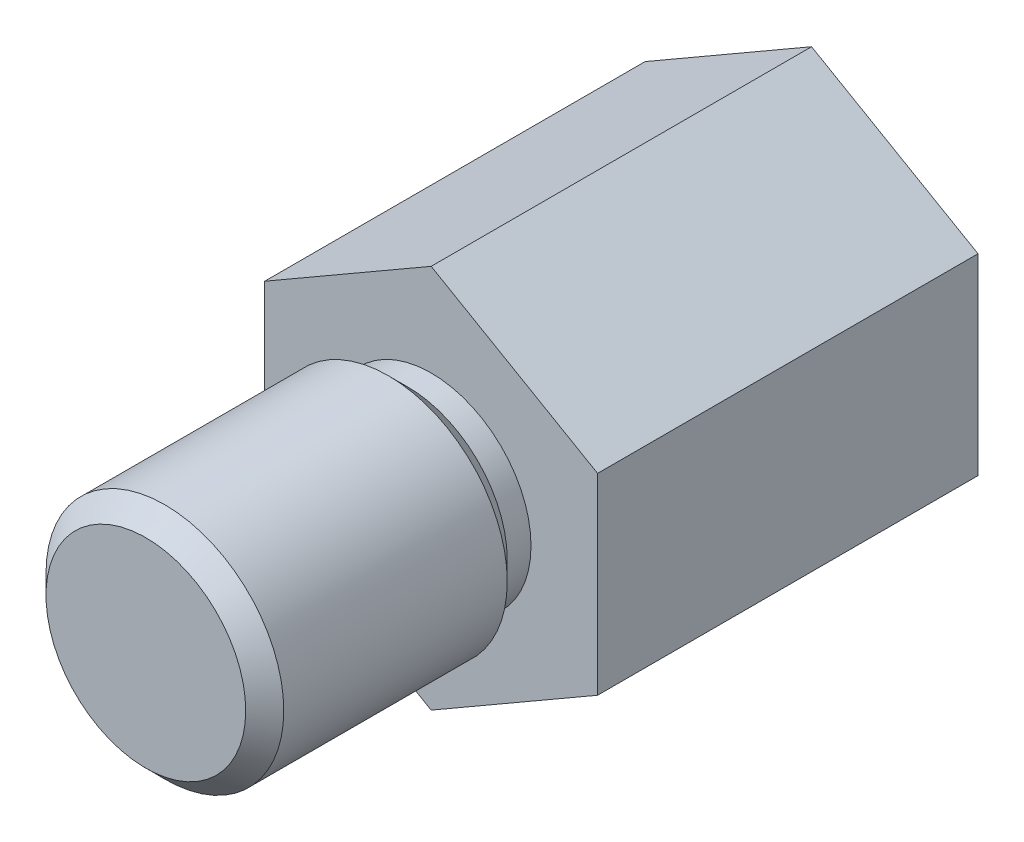
ISO-10303-21;
HEADER;
FILE_DESCRIPTION(('STEP AP214'),'2;1');
FILE_NAME('part.step','',(''),(''),'','','');
FILE_SCHEMA(('AUTOMOTIVE_DESIGN { 1 0 10303 214 1 1 1 1 }'));
ENDSEC;
DATA;
#1=APPLICATION_CONTEXT('core data for automotive mechanical design processes');
#2=APPLICATION_PROTOCOL_DEFINITION('international standard','automotive_design',2000,#1);
#3=PRODUCT_CONTEXT('',#1,'mechanical');
#4=PRODUCT('Part','Part','',(#3));
#5=PRODUCT_RELATED_PRODUCT_CATEGORY('part','',(#4));
#6=PRODUCT_DEFINITION_FORMATION('','',#4);
#7=PRODUCT_DEFINITION_CONTEXT('part definition',#1,'design');
#8=PRODUCT_DEFINITION('design','',#6,#7);
#9=PRODUCT_DEFINITION_SHAPE('','',#8);
#10=(LENGTH_UNIT() NAMED_UNIT(*) SI_UNIT(.MILLI.,.METRE.));
#11=(NAMED_UNIT(*) PLANE_ANGLE_UNIT() SI_UNIT($,.RADIAN.));
#12=(NAMED_UNIT(*) SI_UNIT($,.STERADIAN.) SOLID_ANGLE_UNIT());
#13=UNCERTAINTY_MEASURE_WITH_UNIT(LENGTH_MEASURE(1.E-05),#10,'distance_accuracy_value','');
#14=(GEOMETRIC_REPRESENTATION_CONTEXT(3) GLOBAL_UNCERTAINTY_ASSIGNED_CONTEXT((#13)) GLOBAL_UNIT_ASSIGNED_CONTEXT((#10,
#11,#12)) REPRESENTATION_CONTEXT('',''));
#15=CARTESIAN_POINT('',(0.,0.,0.));
#16=DIRECTION('',(0.,0.,1.));
#17=DIRECTION('',(1.,0.,0.));
#18=AXIS2_PLACEMENT_3D('',#15,#16,#17);
#19=CARTESIAN_POINT('',(0.,4.04145188432737,8.));
#20=DIRECTION('',(0.,0.,1.));
#21=DIRECTION('',(1.,0.,0.));
#22=AXIS2_PLACEMENT_3D('',#19,#20,#21);
#23=PLANE('',#22);
#24=DIRECTION('',(-0.866025403784438,0.5,0.));
#25=VECTOR('',#24,1.);
#26=CARTESIAN_POINT('',(3.49999999999999,2.02072594216368,8.));
#27=LINE('',#26,#25);
#28=CARTESIAN_POINT('',(3.49999999999999,2.02072594216368,8.));
#29=VERTEX_POINT('',#28);
#30=CARTESIAN_POINT('',(0.,4.04145188432737,8.));
#31=VERTEX_POINT('',#30);
#32=EDGE_CURVE('E119',#29,#31,#27,.T.);
#33=ORIENTED_EDGE('',*,*,#32,.T.);
#34=DIRECTION('',(-0.866025403784438,-0.5,0.));
#35=VECTOR('',#34,1.);
#36=CARTESIAN_POINT('',(0.,4.04145188432737,8.));
#37=LINE('',#36,#35);
#38=CARTESIAN_POINT('',(-3.5,2.02072594216368,8.));
#39=VERTEX_POINT('',#38);
#40=EDGE_CURVE('E121',#31,#39,#37,.T.);
#41=ORIENTED_EDGE('',*,*,#40,.T.);
#42=DIRECTION('',(0.,-1.,0.));
#43=VECTOR('',#42,1.);
#44=CARTESIAN_POINT('',(-3.5,2.02072594216368,8.));
#45=LINE('',#44,#43);
#46=CARTESIAN_POINT('',(-3.5,-2.0207259421637,8.));
#47=VERTEX_POINT('',#46);
#48=EDGE_CURVE('E123',#39,#47,#45,.T.);
#49=ORIENTED_EDGE('',*,*,#48,.T.);
#50=DIRECTION('',(0.866025403784438,-0.5,0.));
#51=VECTOR('',#50,1.);
#52=CARTESIAN_POINT('',(-3.5,-2.0207259421637,8.));
#53=LINE('',#52,#51);
#54=CARTESIAN_POINT('',(0.,-4.04145188432739,8.));
#55=VERTEX_POINT('',#54);
#56=EDGE_CURVE('E125',#47,#55,#53,.T.);
#57=ORIENTED_EDGE('',*,*,#56,.T.);
#58=DIRECTION('',(0.866025403784439,0.5,0.));
#59=VECTOR('',#58,1.);
#60=CARTESIAN_POINT('',(0.,-4.04145188432739,8.));
#61=LINE('',#60,#59);
#62=CARTESIAN_POINT('',(3.49999999999999,-2.0207259421637,8.));
#63=VERTEX_POINT('',#62);
#64=EDGE_CURVE('E49',#55,#63,#61,.T.);
#65=ORIENTED_EDGE('',*,*,#64,.T.);
#66=DIRECTION('',(0.,1.,0.));
#67=VECTOR('',#66,1.);
#68=CARTESIAN_POINT('',(3.49999999999999,-2.0207259421637,8.));
#69=LINE('',#68,#67);
#70=EDGE_CURVE('E44',#63,#29,#69,.T.);
#71=ORIENTED_EDGE('',*,*,#70,.T.);
#72=EDGE_LOOP('',(#33,#41,#49,#57,#65,#71));
#73=FACE_BOUND('',#72,.T.);
#74=CARTESIAN_POINT('',(0.,0.,8.));
#75=DIRECTION('',(0.,0.,1.));
#76=DIRECTION('',(1.,0.,0.));
#77=AXIS2_PLACEMENT_3D('',#74,#75,#76);
#78=CIRCLE('',#77,2.1);
#79=CARTESIAN_POINT('',(2.1,0.,8.));
#80=VERTEX_POINT('',#79);
#81=EDGE_CURVE('E100',#80,#80,#78,.T.);
#82=ORIENTED_EDGE('',*,*,#81,.F.);
#83=EDGE_LOOP('',(#82));
#84=FACE_BOUND('',#83,.T.);
#85=ADVANCED_FACE('F29',(#73,#84),#23,.T.);
#86=CARTESIAN_POINT('',(3.49999999999999,2.02072594216368,8.));
#87=DIRECTION('',(-0.5,-0.866025403784438,0.));
#88=DIRECTION('',(0.866025403784438,-0.5,0.));
#89=AXIS2_PLACEMENT_3D('',#86,#87,#88);
#90=PLANE('',#89);
#91=DIRECTION('',(-0.866025403784438,0.5,0.));
#92=VECTOR('',#91,1.);
#93=CARTESIAN_POINT('',(3.49999999999999,2.02072594216368,0.));
#94=LINE('',#93,#92);
#95=CARTESIAN_POINT('',(3.49999999999999,2.02072594216368,0.));
#96=VERTEX_POINT('',#95);
#97=CARTESIAN_POINT('',(0.,4.04145188432737,0.));
#98=VERTEX_POINT('',#97);
#99=EDGE_CURVE('E106',#96,#98,#94,.T.);
#100=ORIENTED_EDGE('',*,*,#99,.T.);
#101=DIRECTION('',(0.,0.,-1.));
#102=VECTOR('',#101,1.);
#103=CARTESIAN_POINT('',(0.,4.04145188432737,8.));
#104=LINE('',#103,#102);
#105=EDGE_CURVE('E144',#31,#98,#104,.T.);
#106=ORIENTED_EDGE('',*,*,#105,.F.);
#107=ORIENTED_EDGE('',*,*,#32,.F.);
#108=DIRECTION('',(0.,0.,-1.));
#109=VECTOR('',#108,1.);
#110=CARTESIAN_POINT('',(3.49999999999999,2.02072594216368,8.));
#111=LINE('',#110,#109);
#112=EDGE_CURVE('E129',#29,#96,#111,.T.);
#113=ORIENTED_EDGE('',*,*,#112,.T.);
#114=EDGE_LOOP('',(#100,#106,#107,#113));
#115=FACE_BOUND('',#114,.T.);
#116=ADVANCED_FACE('F31',(#115),#90,.F.);
#117=CARTESIAN_POINT('',(0.,4.04145188432737,8.));
#118=DIRECTION('',(0.5,-0.866025403784438,0.));
#119=DIRECTION('',(0.866025403784438,0.5,0.));
#120=AXIS2_PLACEMENT_3D('',#117,#118,#119);
#121=PLANE('',#120);
#122=DIRECTION('',(-0.866025403784438,-0.5,0.));
#123=VECTOR('',#122,1.);
#124=CARTESIAN_POINT('',(0.,4.04145188432737,0.));
#125=LINE('',#124,#123);
#126=CARTESIAN_POINT('',(-3.5,2.02072594216368,0.));
#127=VERTEX_POINT('',#126);
#128=EDGE_CURVE('E109',#98,#127,#125,.T.);
#129=ORIENTED_EDGE('',*,*,#128,.T.);
#130=DIRECTION('',(0.,0.,-1.));
#131=VECTOR('',#130,1.);
#132=CARTESIAN_POINT('',(-3.5,2.02072594216368,8.));
#133=LINE('',#132,#131);
#134=EDGE_CURVE('E141',#39,#127,#133,.T.);
#135=ORIENTED_EDGE('',*,*,#134,.F.);
#136=ORIENTED_EDGE('',*,*,#40,.F.);
#137=ORIENTED_EDGE('',*,*,#105,.T.);
#138=EDGE_LOOP('',(#129,#135,#136,#137));
#139=FACE_BOUND('',#138,.T.);
#140=ADVANCED_FACE('F175',(#139),#121,.F.);
#141=CARTESIAN_POINT('',(-3.5,2.02072594216368,8.));
#142=DIRECTION('',(1.,0.,0.));
#143=DIRECTION('',(0.,0.,-1.));
#144=AXIS2_PLACEMENT_3D('',#141,#142,#143);
#145=PLANE('',#144);
#146=DIRECTION('',(0.,-1.,0.));
#147=VECTOR('',#146,1.);
#148=CARTESIAN_POINT('',(-3.5,2.02072594216368,0.));
#149=LINE('',#148,#147);
#150=CARTESIAN_POINT('',(-3.5,-2.0207259421637,0.));
#151=VERTEX_POINT('',#150);
#152=EDGE_CURVE('E111',#127,#151,#149,.T.);
#153=ORIENTED_EDGE('',*,*,#152,.T.);
#154=DIRECTION('',(0.,0.,-1.));
#155=VECTOR('',#154,1.);
#156=CARTESIAN_POINT('',(-3.5,-2.0207259421637,8.));
#157=LINE('',#156,#155);
#158=EDGE_CURVE('E138',#47,#151,#157,.T.);
#159=ORIENTED_EDGE('',*,*,#158,.F.);
#160=ORIENTED_EDGE('',*,*,#48,.F.);
#161=ORIENTED_EDGE('',*,*,#134,.T.);
#162=EDGE_LOOP('',(#153,#159,#160,#161));
#163=FACE_BOUND('',#162,.T.);
#164=ADVANCED_FACE('F192',(#163),#145,.F.);
#165=CARTESIAN_POINT('',(-3.5,-2.0207259421637,8.));
#166=DIRECTION('',(0.5,0.866025403784439,0.));
#167=DIRECTION('',(-0.866025403784439,0.5,0.));
#168=AXIS2_PLACEMENT_3D('',#165,#166,#167);
#169=PLANE('',#168);
#170=DIRECTION('',(0.866025403784438,-0.5,0.));
#171=VECTOR('',#170,1.);
#172=CARTESIAN_POINT('',(-3.5,-2.0207259421637,0.));
#173=LINE('',#172,#171);
#174=CARTESIAN_POINT('',(0.,-4.04145188432739,0.));
#175=VERTEX_POINT('',#174);
#176=EDGE_CURVE('E113',#151,#175,#173,.T.);
#177=ORIENTED_EDGE('',*,*,#176,.T.);
#178=DIRECTION('',(0.,0.,-1.));
#179=VECTOR('',#178,1.);
#180=CARTESIAN_POINT('',(0.,-4.04145188432739,8.));
#181=LINE('',#180,#179);
#182=EDGE_CURVE('E135',#55,#175,#181,.T.);
#183=ORIENTED_EDGE('',*,*,#182,.F.);
#184=ORIENTED_EDGE('',*,*,#56,.F.);
#185=ORIENTED_EDGE('',*,*,#158,.T.);
#186=EDGE_LOOP('',(#177,#183,#184,#185));
#187=FACE_BOUND('',#186,.T.);
#188=ADVANCED_FACE('F188',(#187),#169,.F.);
#189=CARTESIAN_POINT('',(0.,-4.04145188432739,8.));
#190=DIRECTION('',(-0.5,0.866025403784439,0.));
#191=DIRECTION('',(-0.866025403784439,-0.5,0.));
#192=AXIS2_PLACEMENT_3D('',#189,#190,#191);
#193=PLANE('',#192);
#194=DIRECTION('',(0.866025403784439,0.5,0.));
#195=VECTOR('',#194,1.);
#196=CARTESIAN_POINT('',(0.,-4.04145188432739,0.));
#197=LINE('',#196,#195);
#198=CARTESIAN_POINT('',(3.49999999999999,-2.0207259421637,0.));
#199=VERTEX_POINT('',#198);
#200=EDGE_CURVE('E115',#175,#199,#197,.T.);
#201=ORIENTED_EDGE('',*,*,#200,.T.);
#202=DIRECTION('',(0.,0.,-1.));
#203=VECTOR('',#202,1.);
#204=CARTESIAN_POINT('',(3.49999999999999,-2.0207259421637,8.));
#205=LINE('',#204,#203);
#206=EDGE_CURVE('E132',#63,#199,#205,.T.);
#207=ORIENTED_EDGE('',*,*,#206,.F.);
#208=ORIENTED_EDGE('',*,*,#64,.F.);
#209=ORIENTED_EDGE('',*,*,#182,.T.);
#210=EDGE_LOOP('',(#201,#207,#208,#209));
#211=FACE_BOUND('',#210,.T.);
#212=ADVANCED_FACE('F184',(#211),#193,.F.);
#213=CARTESIAN_POINT('',(3.49999999999999,-2.0207259421637,8.));
#214=DIRECTION('',(-1.,0.,0.));
#215=DIRECTION('',(0.,-1.,0.));
#216=AXIS2_PLACEMENT_3D('',#213,#214,#215);
#217=PLANE('',#216);
#218=DIRECTION('',(0.,1.,0.));
#219=VECTOR('',#218,1.);
#220=CARTESIAN_POINT('',(3.49999999999999,-2.0207259421637,0.));
#221=LINE('',#220,#219);
#222=EDGE_CURVE('E117',#199,#96,#221,.T.);
#223=ORIENTED_EDGE('',*,*,#222,.T.);
#224=ORIENTED_EDGE('',*,*,#112,.F.);
#225=ORIENTED_EDGE('',*,*,#70,.F.);
#226=ORIENTED_EDGE('',*,*,#206,.T.);
#227=EDGE_LOOP('',(#223,#224,#225,#226));
#228=FACE_BOUND('',#227,.T.);
#229=ADVANCED_FACE('F181',(#228),#217,.F.);
#230=CARTESIAN_POINT('',(0.,4.04145188432737,0.));
#231=DIRECTION('',(0.,0.,1.));
#232=DIRECTION('',(1.,0.,0.));
#233=AXIS2_PLACEMENT_3D('',#230,#231,#232);
#234=PLANE('',#233);
#235=CARTESIAN_POINT('',(0.,0.,0.));
#236=DIRECTION('',(0.,0.,-1.));
#237=DIRECTION('',(-1.,0.,0.));
#238=AXIS2_PLACEMENT_3D('',#235,#236,#237);
#239=CIRCLE('',#238,2.);
#240=CARTESIAN_POINT('',(-2.,0.,0.));
#241=VERTEX_POINT('',#240);
#242=EDGE_CURVE('E95',#241,#241,#239,.T.);
#243=ORIENTED_EDGE('',*,*,#242,.F.);
#244=EDGE_LOOP('',(#243));
#245=FACE_BOUND('',#244,.T.);
#246=ORIENTED_EDGE('',*,*,#99,.F.);
#247=ORIENTED_EDGE('',*,*,#222,.F.);
#248=ORIENTED_EDGE('',*,*,#200,.F.);
#249=ORIENTED_EDGE('',*,*,#176,.F.);
#250=ORIENTED_EDGE('',*,*,#152,.F.);
#251=ORIENTED_EDGE('',*,*,#128,.F.);
#252=EDGE_LOOP('',(#246,#247,#248,#249,#250,#251));
#253=FACE_BOUND('',#252,.T.);
#254=ADVANCED_FACE('F180',(#245,#253),#234,.F.);
#255=CARTESIAN_POINT('',(0.,0.,8.5));
#256=DIRECTION('',(0.,0.,-1.));
#257=DIRECTION('',(-1.,0.,0.));
#258=AXIS2_PLACEMENT_3D('',#255,#256,#257);
#259=CYLINDRICAL_SURFACE('',#258,2.1);
#260=CARTESIAN_POINT('',(0.,0.,8.5));
#261=DIRECTION('',(0.,0.,1.));
#262=DIRECTION('',(1.,0.,0.));
#263=AXIS2_PLACEMENT_3D('',#260,#261,#262);
#264=CIRCLE('',#263,2.1);
#265=CARTESIAN_POINT('',(2.1,0.,8.5));
#266=VERTEX_POINT('',#265);
#267=EDGE_CURVE('E103',#266,#266,#264,.T.);
#268=ORIENTED_EDGE('',*,*,#267,.F.);
#269=EDGE_LOOP('',(#268));
#270=FACE_BOUND('',#269,.T.);
#271=ORIENTED_EDGE('',*,*,#81,.T.);
#272=EDGE_LOOP('',(#271));
#273=FACE_BOUND('',#272,.T.);
#274=ADVANCED_FACE('F214',(#270,#273),#259,.T.);
#275=CARTESIAN_POINT('',(0.,0.,14.));
#276=DIRECTION('',(0.,0.,1.));
#277=DIRECTION('',(1.,0.,0.));
#278=AXIS2_PLACEMENT_3D('',#275,#276,#277);
#279=PLANE('',#278);
#280=CARTESIAN_POINT('',(0.,0.,14.));
#281=DIRECTION('',(0.,0.,1.));
#282=DIRECTION('',(1.,0.,0.));
#283=AXIS2_PLACEMENT_3D('',#280,#281,#282);
#284=CIRCLE('',#283,2.1);
#285=CARTESIAN_POINT('',(2.1,0.,14.));
#286=VERTEX_POINT('',#285);
#287=EDGE_CURVE('E11',#286,#286,#284,.T.);
#288=ORIENTED_EDGE('',*,*,#287,.T.);
#289=EDGE_LOOP('',(#288));
#290=FACE_BOUND('',#289,.T.);
#291=ADVANCED_FACE('F167',(#290),#279,.T.);
#292=CARTESIAN_POINT('',(0.,0.,14.));
#293=DIRECTION('',(0.,0.,-1.));
#294=DIRECTION('',(-1.,0.,0.));
#295=AXIS2_PLACEMENT_3D('',#292,#293,#294);
#296=CYLINDRICAL_SURFACE('',#295,2.5);
#297=CARTESIAN_POINT('',(0.,0.,8.9));
#298=DIRECTION('',(0.,0.,1.));
#299=DIRECTION('',(1.,0.,0.));
#300=AXIS2_PLACEMENT_3D('',#297,#298,#299);
#301=CIRCLE('',#300,2.5);
#302=CARTESIAN_POINT('',(2.5,0.,8.9));
#303=VERTEX_POINT('',#302);
#304=EDGE_CURVE('E37',#303,#303,#301,.T.);
#305=ORIENTED_EDGE('',*,*,#304,.T.);
#306=EDGE_LOOP('',(#305));
#307=FACE_BOUND('',#306,.T.);
#308=CARTESIAN_POINT('',(0.,0.,13.6));
#309=DIRECTION('',(0.,0.,1.));
#310=DIRECTION('',(1.,0.,0.));
#311=AXIS2_PLACEMENT_3D('',#308,#309,#310);
#312=CIRCLE('',#311,2.5);
#313=CARTESIAN_POINT('',(2.5,0.,13.6));
#314=VERTEX_POINT('',#313);
#315=EDGE_CURVE('E147',#314,#314,#312,.F.);
#316=ORIENTED_EDGE('',*,*,#315,.T.);
#317=EDGE_LOOP('',(#316));
#318=FACE_BOUND('',#317,.T.);
#319=ADVANCED_FACE('F152',(#307,#318),#296,.T.);
#320=CARTESIAN_POINT('',(0.,0.,8.9));
#321=DIRECTION('',(0.,0.,1.));
#322=DIRECTION('',(1.,0.,0.));
#323=AXIS2_PLACEMENT_3D('',#320,#321,#322);
#324=CONICAL_SURFACE('',#323,2.5,0.785398163397451);
#325=CARTESIAN_POINT('',(2.1,0.,8.5));
#326=CARTESIAN_POINT('',(2.10416666666666,0.,8.50416666666666));
#327=CARTESIAN_POINT('',(2.10833333333333,0.,8.50833333333333));
#328=CARTESIAN_POINT('',(2.11666666666666,0.,8.51666666666667));
#329=CARTESIAN_POINT('',(2.12083333333333,0.,8.52083333333333));
#330=CARTESIAN_POINT('',(2.12916666666666,0.,8.52916666666667));
#331=CARTESIAN_POINT('',(2.13333333333333,0.,8.53333333333333));
#332=CARTESIAN_POINT('',(2.14166666666666,0.,8.54166666666667));
#333=CARTESIAN_POINT('',(2.14583333333333,0.,8.54583333333333));
#334=CARTESIAN_POINT('',(2.15416666666666,0.,8.55416666666667));
#335=CARTESIAN_POINT('',(2.15833333333333,0.,8.55833333333333));
#336=CARTESIAN_POINT('',(2.16666666666666,0.,8.56666666666666));
#337=CARTESIAN_POINT('',(2.17083333333333,0.,8.57083333333333));
#338=CARTESIAN_POINT('',(2.17916666666666,0.,8.57916666666667));
#339=CARTESIAN_POINT('',(2.18333333333333,0.,8.58333333333333));
#340=CARTESIAN_POINT('',(2.19166666666666,0.,8.59166666666667));
#341=CARTESIAN_POINT('',(2.19583333333333,0.,8.59583333333333));
#342=CARTESIAN_POINT('',(2.20416666666666,0.,8.60416666666667));
#343=CARTESIAN_POINT('',(2.20833333333333,0.,8.60833333333333));
#344=CARTESIAN_POINT('',(2.21666666666666,0.,8.61666666666667));
#345=CARTESIAN_POINT('',(2.22083333333333,0.,8.62083333333333));
#346=CARTESIAN_POINT('',(2.22916666666666,0.,8.62916666666666));
#347=CARTESIAN_POINT('',(2.23333333333333,0.,8.63333333333333));
#348=CARTESIAN_POINT('',(2.24166666666666,0.,8.64166666666667));
#349=CARTESIAN_POINT('',(2.24583333333333,0.,8.64583333333333));
#350=CARTESIAN_POINT('',(2.25416666666666,0.,8.65416666666667));
#351=CARTESIAN_POINT('',(2.25833333333333,0.,8.65833333333333));
#352=CARTESIAN_POINT('',(2.26666666666666,0.,8.66666666666667));
#353=CARTESIAN_POINT('',(2.27083333333333,0.,8.67083333333333));
#354=CARTESIAN_POINT('',(2.27916666666667,0.,8.67916666666667));
#355=CARTESIAN_POINT('',(2.28333333333333,0.,8.68333333333333));
#356=CARTESIAN_POINT('',(2.29166666666666,0.,8.69166666666666));
#357=CARTESIAN_POINT('',(2.29583333333333,0.,8.69583333333333));
#358=CARTESIAN_POINT('',(2.30416666666666,0.,8.70416666666667));
#359=CARTESIAN_POINT('',(2.30833333333333,0.,8.70833333333333));
#360=CARTESIAN_POINT('',(2.31666666666666,0.,8.71666666666667));
#361=CARTESIAN_POINT('',(2.32083333333333,0.,8.72083333333333));
#362=CARTESIAN_POINT('',(2.32916666666666,0.,8.72916666666667));
#363=CARTESIAN_POINT('',(2.33333333333333,0.,8.73333333333333));
#364=CARTESIAN_POINT('',(2.34166666666667,0.,8.74166666666667));
#365=CARTESIAN_POINT('',(2.34583333333333,0.,8.74583333333333));
#366=CARTESIAN_POINT('',(2.35416666666667,0.,8.75416666666666));
#367=CARTESIAN_POINT('',(2.35833333333333,0.,8.75833333333333));
#368=CARTESIAN_POINT('',(2.36666666666666,0.,8.76666666666667));
#369=CARTESIAN_POINT('',(2.37083333333333,0.,8.77083333333333));
#370=CARTESIAN_POINT('',(2.37916666666667,0.,8.77916666666667));
#371=CARTESIAN_POINT('',(2.38333333333333,0.,8.78333333333333));
#372=CARTESIAN_POINT('',(2.39166666666667,0.,8.79166666666666));
#373=CARTESIAN_POINT('',(2.39583333333333,0.,8.79583333333333));
#374=CARTESIAN_POINT('',(2.40416666666667,0.,8.80416666666667));
#375=CARTESIAN_POINT('',(2.40833333333333,0.,8.80833333333333));
#376=CARTESIAN_POINT('',(2.41666666666667,0.,8.81666666666666));
#377=CARTESIAN_POINT('',(2.42083333333333,0.,8.82083333333333));
#378=CARTESIAN_POINT('',(2.42916666666667,0.,8.82916666666667));
#379=CARTESIAN_POINT('',(2.43333333333333,0.,8.83333333333333));
#380=CARTESIAN_POINT('',(2.44166666666667,0.,8.84166666666667));
#381=CARTESIAN_POINT('',(2.44583333333333,0.,8.84583333333333));
#382=CARTESIAN_POINT('',(2.45416666666667,0.,8.85416666666666));
#383=CARTESIAN_POINT('',(2.45833333333333,0.,8.85833333333333));
#384=CARTESIAN_POINT('',(2.46666666666667,0.,8.86666666666667));
#385=CARTESIAN_POINT('',(2.47083333333333,0.,8.87083333333333));
#386=CARTESIAN_POINT('',(2.47916666666667,0.,8.87916666666666));
#387=CARTESIAN_POINT('',(2.48333333333333,0.,8.88333333333333));
#388=CARTESIAN_POINT('',(2.49166666666667,0.,8.89166666666667));
#389=CARTESIAN_POINT('',(2.49583333333333,0.,8.89583333333333));
#390=CARTESIAN_POINT('',(2.5,0.,8.9));
#391=B_SPLINE_CURVE_WITH_KNOTS('',3,(#325,#326,#327,#328,#329,#330,#331,#332,#333,#334,#335,
#336,#337,#338,#339,#340,#341,#342,#343,#344,#345,#346,#347,#348,#349,#350,#351,#352,#353,#354,
#355,#356,#357,#358,#359,#360,#361,#362,#363,#364,#365,#366,#367,#368,#369,#370,#371,#372,#373,
#374,#375,#376,#377,#378,#379,#380,#381,#382,#383,#384,#385,#386,#387,#388,#389,#390),
.UNSPECIFIED.,.F.,.F.,(4,2,2,2,2,2,2,2,2,2,2,2,2,2,2,2,2,2,2,2,2,2,2,2,2,2,2,2,2,2,2,2,4),(0.,
0.0176776695296639,0.0353553390593278,0.053033008588992,0.0707106781186558,0.0883883476483185,
0.106066017177983,0.123743686707647,0.14142135623731,0.159099025766975,0.176776695296637,
0.194454364826301,0.212132034355965,0.229809703885629,0.247487373415292,0.265165042944956,
0.28284271247462,0.300520382004284,0.318198051533948,0.335875721063611,0.353553390593275,
0.371231060122938,0.388908729652603,0.406586399182265,0.424264068711929,0.441941738241593,
0.459619407771257,0.477297077300921,0.494974746830584,0.512652416360248,0.530330085889912,
0.548007755419576,0.56568542494924),.UNSPECIFIED.);
#392=EDGE_CURVE('BSEAM155',#266,#303,#391,.T.);
#393=ORIENTED_EDGE('',*,*,#267,.T.);
#394=ORIENTED_EDGE('',*,*,#304,.F.);
#395=ORIENTED_EDGE('',*,*,#392,.T.);
#396=ORIENTED_EDGE('',*,*,#392,.F.);
#397=EDGE_LOOP('',(#393,#395,#394,#396));
#398=FACE_BOUND('',#397,.T.);
#399=ADVANCED_FACE('F155',(#398),#324,.T.);
#400=CARTESIAN_POINT('',(0.,0.,14.));
#401=DIRECTION('',(0.,0.,-1.));
#402=DIRECTION('',(-1.,0.,0.));
#403=AXIS2_PLACEMENT_3D('',#400,#401,#402);
#404=CONICAL_SURFACE('',#403,2.1,0.785398163397446);
#405=ORIENTED_EDGE('',*,*,#315,.F.);
#406=EDGE_LOOP('',(#405));
#407=FACE_BOUND('',#406,.T.);
#408=ORIENTED_EDGE('',*,*,#287,.F.);
#409=EDGE_LOOP('',(#408));
#410=FACE_BOUND('',#409,.T.);
#411=ADVANCED_FACE('F157',(#407,#410),#404,.T.);
#412=CARTESIAN_POINT('',(0.,0.,0.));
#413=DIRECTION('',(0.,0.,-1.));
#414=DIRECTION('',(-1.,0.,0.));
#415=AXIS2_PLACEMENT_3D('',#412,#413,#414);
#416=CONICAL_SURFACE('',#415,2.,0.785398163397446);
#417=CARTESIAN_POINT('',(0.,0.,0.350000000000001));
#418=DIRECTION('',(0.,0.,-1.));
#419=DIRECTION('',(-1.,0.,0.));
#420=AXIS2_PLACEMENT_3D('',#417,#418,#419);
#421=CIRCLE('',#420,1.65);
#422=CARTESIAN_POINT('',(-1.65,0.,0.350000000000001));
#423=VERTEX_POINT('',#422);
#424=EDGE_CURVE('E92',#423,#423,#421,.T.);
#425=ORIENTED_EDGE('',*,*,#424,.F.);
#426=EDGE_LOOP('',(#425));
#427=FACE_BOUND('',#426,.T.);
#428=ORIENTED_EDGE('',*,*,#242,.T.);
#429=EDGE_LOOP('',(#428));
#430=FACE_BOUND('',#429,.T.);
#431=ADVANCED_FACE('F164',(#427,#430),#416,.F.);
#432=CARTESIAN_POINT('',(0.,0.,0.));
#433=DIRECTION('',(0.,0.,-1.));
#434=DIRECTION('',(-1.,0.,0.));
#435=AXIS2_PLACEMENT_3D('',#432,#433,#434);
#436=CYLINDRICAL_SURFACE('',#435,1.65);
#437=CARTESIAN_POINT('',(0.,0.,6.));
#438=DIRECTION('',(0.,0.,-1.));
#439=DIRECTION('',(-1.,0.,0.));
#440=AXIS2_PLACEMENT_3D('',#437,#438,#439);
#441=CIRCLE('',#440,1.65);
#442=CARTESIAN_POINT('',(-1.65,0.,6.));
#443=VERTEX_POINT('',#442);
#444=EDGE_CURVE('E90',#443,#443,#441,.T.);
#445=ORIENTED_EDGE('',*,*,#444,.F.);
#446=EDGE_LOOP('',(#445));
#447=FACE_BOUND('',#446,.T.);
#448=ORIENTED_EDGE('',*,*,#424,.T.);
#449=EDGE_LOOP('',(#448));
#450=FACE_BOUND('',#449,.T.);
#451=ADVANCED_FACE('F86',(#447,#450),#436,.F.);
#452=CARTESIAN_POINT('',(0.,0.,6.));
#453=DIRECTION('',(0.,0.,-1.));
#454=DIRECTION('',(-1.,0.,0.));
#455=AXIS2_PLACEMENT_3D('',#452,#453,#454);
#456=CONICAL_SURFACE('',#455,1.65,1.02974425867665);
#457=CARTESIAN_POINT('',(0.,0.,6.99142002139547));
#458=VERTEX_POINT('',#457);
#459=VERTEX_LOOP('',#458);
#460=FACE_BOUND('',#459,.T.);
#461=ORIENTED_EDGE('',*,*,#444,.T.);
#462=EDGE_LOOP('',(#461));
#463=FACE_BOUND('',#462,.T.);
#464=ADVANCED_FACE('F83',(#460,#463),#456,.F.);
#465=CLOSED_SHELL('',(#85,#116,#140,#164,#188,#212,#229,#254,#274,#291,#319,#399,#411,#431,#451,#464));
#466=MANIFOLD_SOLID_BREP('B2',#465);
#467=ADVANCED_BREP_SHAPE_REPRESENTATION('',(#18,#466),#14);
#468=SHAPE_DEFINITION_REPRESENTATION(#9,#467);
ENDSEC;
END-ISO-10303-21;
